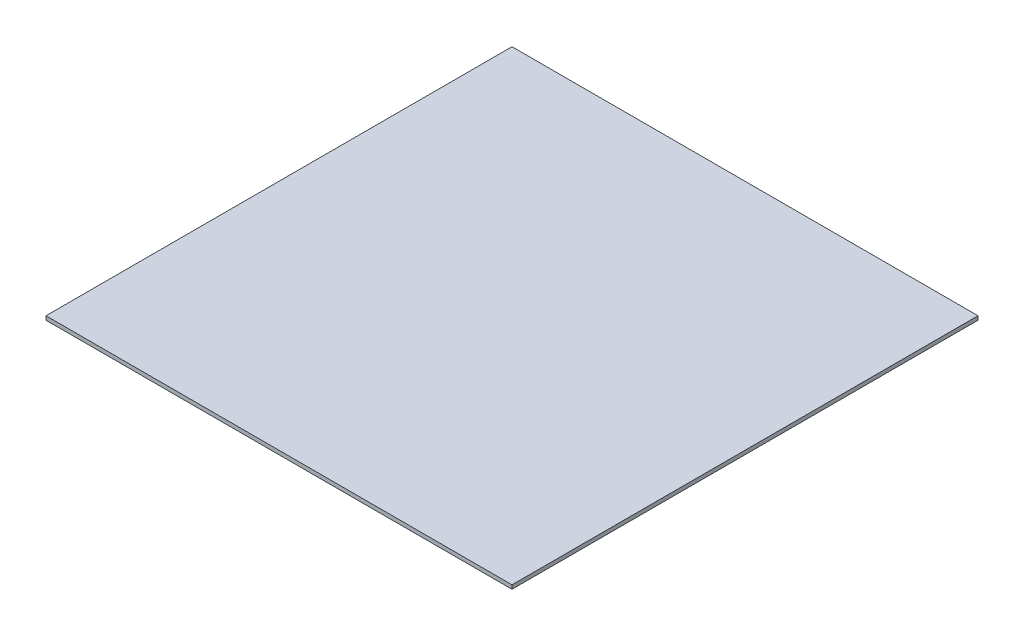
ISO-10303-21;
HEADER;
FILE_DESCRIPTION(('STEP AP214'),'2;1');
FILE_NAME('part.step','',(''),(''),'','','');
FILE_SCHEMA(('AUTOMOTIVE_DESIGN { 1 0 10303 214 1 1 1 1 }'));
ENDSEC;
DATA;
#1=APPLICATION_CONTEXT('core data for automotive mechanical design processes');
#2=APPLICATION_PROTOCOL_DEFINITION('international standard','automotive_design',2000,#1);
#3=PRODUCT_CONTEXT('',#1,'mechanical');
#4=PRODUCT('Part','Part','',(#3));
#5=PRODUCT_RELATED_PRODUCT_CATEGORY('part','',(#4));
#6=PRODUCT_DEFINITION_FORMATION('','',#4);
#7=PRODUCT_DEFINITION_CONTEXT('part definition',#1,'design');
#8=PRODUCT_DEFINITION('design','',#6,#7);
#9=PRODUCT_DEFINITION_SHAPE('','',#8);
#10=(LENGTH_UNIT() NAMED_UNIT(*) SI_UNIT(.MILLI.,.METRE.));
#11=(NAMED_UNIT(*) PLANE_ANGLE_UNIT() SI_UNIT($,.RADIAN.));
#12=(NAMED_UNIT(*) SI_UNIT($,.STERADIAN.) SOLID_ANGLE_UNIT());
#13=UNCERTAINTY_MEASURE_WITH_UNIT(LENGTH_MEASURE(1.E-05),#10,'distance_accuracy_value','');
#14=(GEOMETRIC_REPRESENTATION_CONTEXT(3) GLOBAL_UNCERTAINTY_ASSIGNED_CONTEXT((#13)) GLOBAL_UNIT_ASSIGNED_CONTEXT((#10,
#11,#12)) REPRESENTATION_CONTEXT('',''));
#15=CARTESIAN_POINT('',(0.,0.,0.));
#16=DIRECTION('',(0.,0.,1.));
#17=DIRECTION('',(1.,0.,0.));
#18=AXIS2_PLACEMENT_3D('',#15,#16,#17);
#19=CARTESIAN_POINT('',(-381.,6.35,-381.));
#20=DIRECTION('',(1.,0.,0.));
#21=DIRECTION('',(0.,0.,-1.));
#22=AXIS2_PLACEMENT_3D('',#19,#20,#21);
#23=PLANE('',#22);
#24=DIRECTION('',(0.,0.,1.));
#25=VECTOR('',#24,1.);
#26=CARTESIAN_POINT('',(-381.,0.,-381.));
#27=LINE('',#26,#25);
#28=CARTESIAN_POINT('',(-381.,0.,-381.));
#29=VERTEX_POINT('',#28);
#30=CARTESIAN_POINT('',(-381.,0.,381.));
#31=VERTEX_POINT('',#30);
#32=EDGE_CURVE('E96',#29,#31,#27,.T.);
#33=ORIENTED_EDGE('',*,*,#32,.T.);
#34=DIRECTION('',(0.,-1.,0.));
#35=VECTOR('',#34,1.);
#36=CARTESIAN_POINT('',(-381.,6.35,381.));
#37=LINE('',#36,#35);
#38=CARTESIAN_POINT('',(-381.,6.35,381.));
#39=VERTEX_POINT('',#38);
#40=EDGE_CURVE('E11',#39,#31,#37,.T.);
#41=ORIENTED_EDGE('',*,*,#40,.F.);
#42=DIRECTION('',(0.,0.,1.));
#43=VECTOR('',#42,1.);
#44=CARTESIAN_POINT('',(-381.,6.35,-381.));
#45=LINE('',#44,#43);
#46=CARTESIAN_POINT('',(-381.,6.35,-381.));
#47=VERTEX_POINT('',#46);
#48=EDGE_CURVE('E82',#47,#39,#45,.T.);
#49=ORIENTED_EDGE('',*,*,#48,.F.);
#50=DIRECTION('',(0.,-1.,0.));
#51=VECTOR('',#50,1.);
#52=CARTESIAN_POINT('',(-381.,6.35,-381.));
#53=LINE('',#52,#51);
#54=EDGE_CURVE('E49',#47,#29,#53,.T.);
#55=ORIENTED_EDGE('',*,*,#54,.T.);
#56=EDGE_LOOP('',(#33,#41,#49,#55));
#57=FACE_BOUND('',#56,.T.);
#58=ADVANCED_FACE('F33',(#57),#23,.F.);
#59=CARTESIAN_POINT('',(-381.,6.35,381.));
#60=DIRECTION('',(0.,0.,-1.));
#61=DIRECTION('',(-1.,0.,0.));
#62=AXIS2_PLACEMENT_3D('',#59,#60,#61);
#63=PLANE('',#62);
#64=DIRECTION('',(1.,0.,0.));
#65=VECTOR('',#64,1.);
#66=CARTESIAN_POINT('',(-381.,0.,381.));
#67=LINE('',#66,#65);
#68=CARTESIAN_POINT('',(381.,0.,381.));
#69=VERTEX_POINT('',#68);
#70=EDGE_CURVE('E87',#31,#69,#67,.T.);
#71=ORIENTED_EDGE('',*,*,#70,.T.);
#72=DIRECTION('',(0.,-1.,0.));
#73=VECTOR('',#72,1.);
#74=CARTESIAN_POINT('',(381.,6.35,381.));
#75=LINE('',#74,#73);
#76=CARTESIAN_POINT('',(381.,6.35,381.));
#77=VERTEX_POINT('',#76);
#78=EDGE_CURVE('E41',#77,#69,#75,.T.);
#79=ORIENTED_EDGE('',*,*,#78,.F.);
#80=DIRECTION('',(1.,0.,0.));
#81=VECTOR('',#80,1.);
#82=CARTESIAN_POINT('',(-381.,6.35,381.));
#83=LINE('',#82,#81);
#84=EDGE_CURVE('E74',#39,#77,#83,.T.);
#85=ORIENTED_EDGE('',*,*,#84,.F.);
#86=ORIENTED_EDGE('',*,*,#40,.T.);
#87=EDGE_LOOP('',(#71,#79,#85,#86));
#88=FACE_BOUND('',#87,.T.);
#89=ADVANCED_FACE('F86',(#88),#63,.F.);
#90=CARTESIAN_POINT('',(381.,6.35,-381.));
#91=DIRECTION('',(1.,0.,0.));
#92=DIRECTION('',(0.,0.,-1.));
#93=AXIS2_PLACEMENT_3D('',#90,#91,#92);
#94=PLANE('',#93);
#95=DIRECTION('',(0.,0.,1.));
#96=VECTOR('',#95,1.);
#97=CARTESIAN_POINT('',(381.,0.,-381.));
#98=LINE('',#97,#96);
#99=CARTESIAN_POINT('',(381.,0.,-381.));
#100=VERTEX_POINT('',#99);
#101=EDGE_CURVE('E99',#100,#69,#98,.T.);
#102=ORIENTED_EDGE('',*,*,#101,.F.);
#103=DIRECTION('',(0.,-1.,0.));
#104=VECTOR('',#103,1.);
#105=CARTESIAN_POINT('',(381.,6.35,-381.));
#106=LINE('',#105,#104);
#107=CARTESIAN_POINT('',(381.,6.35,-381.));
#108=VERTEX_POINT('',#107);
#109=EDGE_CURVE('E63',#108,#100,#106,.T.);
#110=ORIENTED_EDGE('',*,*,#109,.F.);
#111=DIRECTION('',(0.,0.,1.));
#112=VECTOR('',#111,1.);
#113=CARTESIAN_POINT('',(381.,6.35,-381.));
#114=LINE('',#113,#112);
#115=EDGE_CURVE('E81',#108,#77,#114,.T.);
#116=ORIENTED_EDGE('',*,*,#115,.T.);
#117=ORIENTED_EDGE('',*,*,#78,.T.);
#118=EDGE_LOOP('',(#102,#110,#116,#117));
#119=FACE_BOUND('',#118,.T.);
#120=ADVANCED_FACE('F90',(#119),#94,.T.);
#121=CARTESIAN_POINT('',(-381.,6.35,-381.));
#122=DIRECTION('',(0.,0.,-1.));
#123=DIRECTION('',(-1.,0.,0.));
#124=AXIS2_PLACEMENT_3D('',#121,#122,#123);
#125=PLANE('',#124);
#126=DIRECTION('',(1.,0.,0.));
#127=VECTOR('',#126,1.);
#128=CARTESIAN_POINT('',(-381.,0.,-381.));
#129=LINE('',#128,#127);
#130=EDGE_CURVE('E101',#29,#100,#129,.T.);
#131=ORIENTED_EDGE('',*,*,#130,.F.);
#132=ORIENTED_EDGE('',*,*,#54,.F.);
#133=DIRECTION('',(1.,0.,0.));
#134=VECTOR('',#133,1.);
#135=CARTESIAN_POINT('',(-381.,6.35,-381.));
#136=LINE('',#135,#134);
#137=EDGE_CURVE('E91',#47,#108,#136,.T.);
#138=ORIENTED_EDGE('',*,*,#137,.T.);
#139=ORIENTED_EDGE('',*,*,#109,.T.);
#140=EDGE_LOOP('',(#131,#132,#138,#139));
#141=FACE_BOUND('',#140,.T.);
#142=ADVANCED_FACE('F107',(#141),#125,.T.);
#143=CARTESIAN_POINT('',(0.,6.35,0.));
#144=DIRECTION('',(0.,1.,0.));
#145=DIRECTION('',(0.,0.,1.));
#146=AXIS2_PLACEMENT_3D('',#143,#144,#145);
#147=PLANE('',#146);
#148=ORIENTED_EDGE('',*,*,#48,.T.);
#149=ORIENTED_EDGE('',*,*,#84,.T.);
#150=ORIENTED_EDGE('',*,*,#115,.F.);
#151=ORIENTED_EDGE('',*,*,#137,.F.);
#152=EDGE_LOOP('',(#148,#149,#150,#151));
#153=FACE_BOUND('',#152,.T.);
#154=ADVANCED_FACE('F78',(#153),#147,.T.);
#155=CARTESIAN_POINT('',(0.,0.,0.));
#156=DIRECTION('',(0.,1.,0.));
#157=DIRECTION('',(0.,0.,1.));
#158=AXIS2_PLACEMENT_3D('',#155,#156,#157);
#159=PLANE('',#158);
#160=ORIENTED_EDGE('',*,*,#32,.F.);
#161=ORIENTED_EDGE('',*,*,#130,.T.);
#162=ORIENTED_EDGE('',*,*,#101,.T.);
#163=ORIENTED_EDGE('',*,*,#70,.F.);
#164=EDGE_LOOP('',(#160,#161,#162,#163));
#165=FACE_BOUND('',#164,.T.);
#166=ADVANCED_FACE('F106',(#165),#159,.F.);
#167=CLOSED_SHELL('',(#58,#89,#120,#142,#154,#166));
#168=MANIFOLD_SOLID_BREP('B2',#167);
#169=ADVANCED_BREP_SHAPE_REPRESENTATION('',(#18,#168),#14);
#170=SHAPE_DEFINITION_REPRESENTATION(#9,#169);
ENDSEC;
END-ISO-10303-21;
